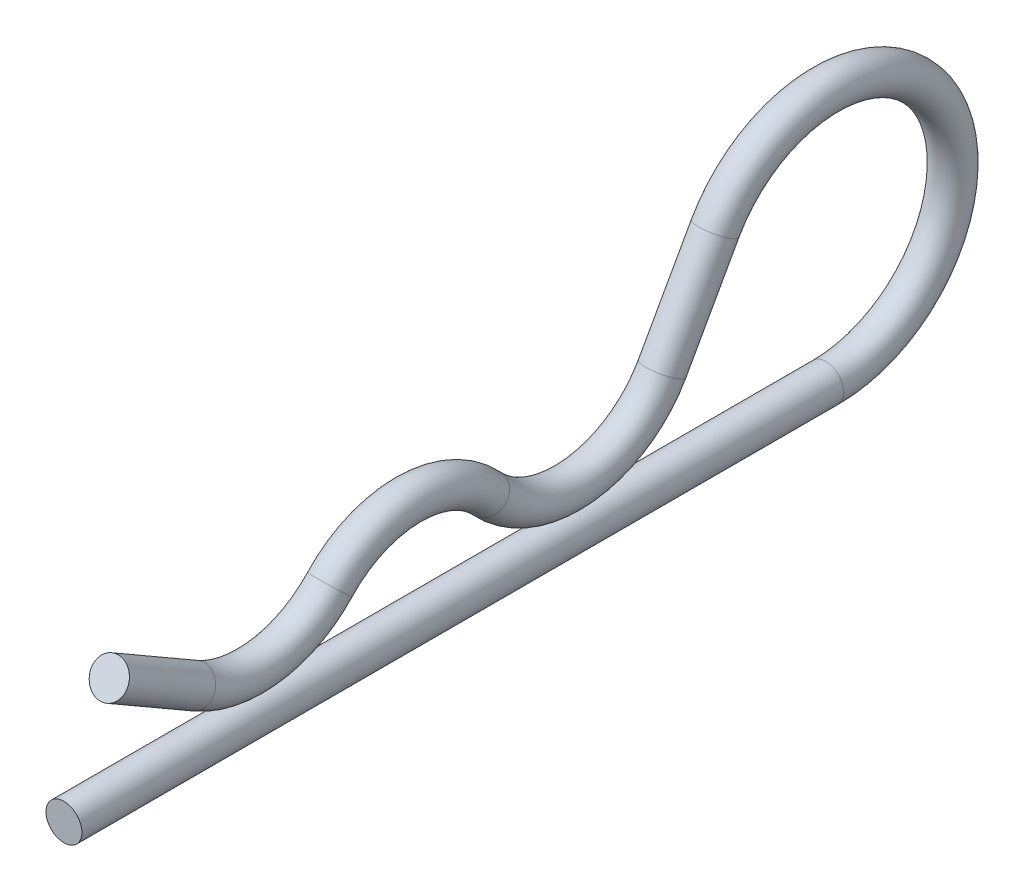
ISO-10303-21;
HEADER;
FILE_DESCRIPTION(('STEP AP214'),'2;1');
FILE_NAME('part.step','',(''),(''),'','','');
FILE_SCHEMA(('AUTOMOTIVE_DESIGN { 1 0 10303 214 1 1 1 1 }'));
ENDSEC;
DATA;
#1=APPLICATION_CONTEXT('core data for automotive mechanical design processes');
#2=APPLICATION_PROTOCOL_DEFINITION('international standard','automotive_design',2000,#1);
#3=PRODUCT_CONTEXT('',#1,'mechanical');
#4=PRODUCT('Part','Part','',(#3));
#5=PRODUCT_RELATED_PRODUCT_CATEGORY('part','',(#4));
#6=PRODUCT_DEFINITION_FORMATION('','',#4);
#7=PRODUCT_DEFINITION_CONTEXT('part definition',#1,'design');
#8=PRODUCT_DEFINITION('design','',#6,#7);
#9=PRODUCT_DEFINITION_SHAPE('','',#8);
#10=(LENGTH_UNIT() NAMED_UNIT(*) SI_UNIT(.MILLI.,.METRE.));
#11=(NAMED_UNIT(*) PLANE_ANGLE_UNIT() SI_UNIT($,.RADIAN.));
#12=(NAMED_UNIT(*) SI_UNIT($,.STERADIAN.) SOLID_ANGLE_UNIT());
#13=UNCERTAINTY_MEASURE_WITH_UNIT(LENGTH_MEASURE(1.E-05),#10,'distance_accuracy_value','');
#14=(GEOMETRIC_REPRESENTATION_CONTEXT(3) GLOBAL_UNCERTAINTY_ASSIGNED_CONTEXT((#13)) GLOBAL_UNIT_ASSIGNED_CONTEXT((#10,
#11,#12)) REPRESENTATION_CONTEXT('',''));
#15=CARTESIAN_POINT('',(0.,0.,0.));
#16=DIRECTION('',(0.,0.,1.));
#17=DIRECTION('',(1.,0.,0.));
#18=AXIS2_PLACEMENT_3D('',#15,#16,#17);
#19=CARTESIAN_POINT('',(0.,0.,16.6751));
#20=DIRECTION('',(0.,0.,1.));
#21=DIRECTION('',(1.,0.,0.));
#22=AXIS2_PLACEMENT_3D('',#19,#20,#21);
#23=PLANE('',#22);
#24=CARTESIAN_POINT('',(0.,0.,16.6751));
#25=DIRECTION('',(0.,0.,1.));
#26=DIRECTION('',(1.,0.,0.));
#27=AXIS2_PLACEMENT_3D('',#24,#25,#26);
#28=CIRCLE('',#27,0.787400000000002);
#29=CARTESIAN_POINT('',(0.787400000000002,0.,16.6751));
#30=VERTEX_POINT('',#29);
#31=EDGE_CURVE('E54',#30,#30,#28,.T.);
#32=ORIENTED_EDGE('',*,*,#31,.T.);
#33=EDGE_LOOP('',(#32));
#34=FACE_BOUND('',#33,.T.);
#35=ADVANCED_FACE('F41',(#34),#23,.T.);
#36=CARTESIAN_POINT('',(0.,4.46971135964693,14.690725));
#37=DIRECTION('',(0.,-0.499999999999994,-0.866025403784442));
#38=DIRECTION('',(1.,0.,0.));
#39=AXIS2_PLACEMENT_3D('',#36,#37,#38);
#40=PLANE('',#39);
#41=CARTESIAN_POINT('',(0.,4.46971135964693,14.690725));
#42=DIRECTION('',(0.,-0.499999999999994,-0.866025403784442));
#43=DIRECTION('',(1.,0.,0.));
#44=AXIS2_PLACEMENT_3D('',#41,#42,#43);
#45=CIRCLE('',#44,0.787400000000002);
#46=CARTESIAN_POINT('',(0.787400000000002,4.46971135964693,14.690725));
#47=VERTEX_POINT('',#46);
#48=EDGE_CURVE('E11',#47,#47,#45,.T.);
#49=ORIENTED_EDGE('',*,*,#48,.F.);
#50=EDGE_LOOP('',(#49));
#51=FACE_BOUND('',#50,.T.);
#52=ADVANCED_FACE('F60',(#51),#40,.F.);
#53=CARTESIAN_POINT('',(0.,0.,16.6751));
#54=DIRECTION('',(0.,0.,-1.));
#55=DIRECTION('',(0.,1.,0.));
#56=AXIS2_PLACEMENT_3D('',#53,#54,#55);
#57=CYLINDRICAL_SURFACE('',#56,0.787400000000002);
#58=CARTESIAN_POINT('',(0.,0.,-16.6751));
#59=DIRECTION('',(0.,0.,1.));
#60=DIRECTION('',(1.,0.,0.));
#61=AXIS2_PLACEMENT_3D('',#58,#59,#60);
#62=CIRCLE('',#61,0.787400000000002);
#63=CARTESIAN_POINT('',(0.,-0.787400000000004,-16.6751));
#64=VERTEX_POINT('',#63);
#65=EDGE_CURVE('E102',#64,#64,#62,.T.);
#66=ORIENTED_EDGE('',*,*,#65,.T.);
#67=EDGE_LOOP('',(#66));
#68=FACE_BOUND('',#67,.T.);
#69=ORIENTED_EDGE('',*,*,#31,.F.);
#70=EDGE_LOOP('',(#69));
#71=FACE_BOUND('',#70,.T.);
#72=ADVANCED_FACE('F62',(#68,#71),#57,.T.);
#73=CARTESIAN_POINT('',(0.,5.5499,-16.6751));
#74=DIRECTION('',(1.,0.,0.));
#75=DIRECTION('',(0.,0.,-1.));
#76=AXIS2_PLACEMENT_3D('',#73,#74,#75);
#77=TOROIDAL_SURFACE('',#76,5.5499,0.787400000000002);
#78=CARTESIAN_POINT('',(0.,8.254232499125,-11.8286605085613));
#79=DIRECTION('',(0.,0.87324807499931,-0.487275896705346));
#80=DIRECTION('',(1.,0.,0.));
#81=AXIS2_PLACEMENT_3D('',#78,#79,#80);
#82=CIRCLE('',#81,0.787400000000002);
#83=CARTESIAN_POINT('',(0.,8.63791354019079,-11.1410649743069));
#84=VERTEX_POINT('',#83);
#85=EDGE_CURVE('E99',#84,#84,#82,.T.);
#86=CARTESIAN_POINT('',(0.,5.5499,-16.6751));
#87=DIRECTION('',(1.,0.,0.));
#88=DIRECTION('',(0.,0.,-1.));
#89=AXIS2_PLACEMENT_3D('',#86,#87,#88);
#90=CIRCLE('',#89,6.3373);
#91=EDGE_CURVE('',#64,#84,#90,.T.);
#92=ORIENTED_EDGE('',*,*,#65,.F.);
#93=ORIENTED_EDGE('',*,*,#85,.T.);
#94=ORIENTED_EDGE('',*,*,#91,.T.);
#95=ORIENTED_EDGE('',*,*,#91,.F.);
#96=EDGE_LOOP('',(#92,#94,#93,#95));
#97=FACE_BOUND('',#96,.T.);
#98=ADVANCED_FACE('F67',(#97),#77,.T.);
#99=CARTESIAN_POINT('',(0.,8.254232499125,-11.8286605085613));
#100=DIRECTION('',(0.,-0.87324807499931,0.487275896705347));
#101=DIRECTION('',(0.,-0.487275896705347,-0.87324807499931));
#102=AXIS2_PLACEMENT_3D('',#99,#100,#101);
#103=CYLINDRICAL_SURFACE('',#102,0.787400000000002);
#104=CARTESIAN_POINT('',(0.,4.09538854194079,-9.50800905050211));
#105=DIRECTION('',(0.,0.873248074999309,-0.487275896705347));
#106=DIRECTION('',(1.,0.,0.));
#107=AXIS2_PLACEMENT_3D('',#104,#105,#106);
#108=CIRCLE('',#107,0.787400000000002);
#109=CARTESIAN_POINT('',(0.,3.711707500875,-10.1956045847566));
#110=VERTEX_POINT('',#109);
#111=EDGE_CURVE('E108',#110,#110,#108,.T.);
#112=ORIENTED_EDGE('',*,*,#111,.T.);
#113=EDGE_LOOP('',(#112));
#114=FACE_BOUND('',#113,.T.);
#115=ORIENTED_EDGE('',*,*,#85,.F.);
#116=EDGE_LOOP('',(#115));
#117=FACE_BOUND('',#116,.T.);
#118=ADVANCED_FACE('F87',(#114,#117),#103,.T.);
#119=CARTESIAN_POINT('',(0.,6.41604,-5.3491650933179));
#120=DIRECTION('',(-1.,0.,0.));
#121=DIRECTION('',(0.,0.,1.));
#122=AXIS2_PLACEMENT_3D('',#119,#120,#121);
#123=TOROIDAL_SURFACE('',#122,4.7625,0.787400000000002);
#124=CARTESIAN_POINT('',(0.,3.18379944473297,-1.85144766006418));
#125=DIRECTION('',(0.,-0.734428857376111,-0.678685680895965));
#126=DIRECTION('',(1.,0.,0.));
#127=AXIS2_PLACEMENT_3D('',#124,#125,#126);
#128=CIRCLE('',#127,0.787400000000002);
#129=CARTESIAN_POINT('',(0.,2.64940233959549,-1.27315837776622));
#130=VERTEX_POINT('',#129);
#131=EDGE_CURVE('E115',#130,#130,#128,.T.);
#132=CARTESIAN_POINT('',(0.,6.41604,-5.3491650933179));
#133=DIRECTION('',(-1.,0.,0.));
#134=DIRECTION('',(0.,0.,1.));
#135=AXIS2_PLACEMENT_3D('',#132,#133,#134);
#136=CIRCLE('',#135,5.5499);
#137=EDGE_CURVE('',#110,#130,#136,.T.);
#138=ORIENTED_EDGE('',*,*,#111,.F.);
#139=ORIENTED_EDGE('',*,*,#131,.T.);
#140=ORIENTED_EDGE('',*,*,#137,.T.);
#141=ORIENTED_EDGE('',*,*,#137,.F.);
#142=EDGE_LOOP('',(#138,#140,#139,#141));
#143=FACE_BOUND('',#142,.T.);
#144=ADVANCED_FACE('F83',(#143),#123,.T.);
#145=CARTESIAN_POINT('',(0.,0.,1.59385));
#146=DIRECTION('',(1.,0.,0.));
#147=DIRECTION('',(0.,0.,-1.));
#148=AXIS2_PLACEMENT_3D('',#145,#146,#147);
#149=TOROIDAL_SURFACE('',#148,4.69112511778631,0.787400000000002);
#150=CARTESIAN_POINT('',(0.,3.18379944473297,5.03914766006418));
#151=DIRECTION('',(0.,0.734428857376111,-0.678685680895965));
#152=DIRECTION('',(1.,0.,0.));
#153=AXIS2_PLACEMENT_3D('',#150,#151,#152);
#154=CIRCLE('',#153,0.787400000000002);
#155=CARTESIAN_POINT('',(0.,2.64940233959549,4.46085837776623));
#156=VERTEX_POINT('',#155);
#157=EDGE_CURVE('E119',#156,#156,#154,.T.);
#158=ORIENTED_EDGE('',*,*,#157,.T.);
#159=EDGE_LOOP('',(#158));
#160=FACE_BOUND('',#159,.T.);
#161=ORIENTED_EDGE('',*,*,#131,.F.);
#162=EDGE_LOOP('',(#161));
#163=FACE_BOUND('',#162,.T.);
#164=ADVANCED_FACE('F77',(#160,#163),#149,.T.);
#165=CARTESIAN_POINT('',(0.,6.41604,8.53686509331791));
#166=DIRECTION('',(-1.,0.,0.));
#167=DIRECTION('',(0.,0.,1.));
#168=AXIS2_PLACEMENT_3D('',#165,#166,#167);
#169=TOROIDAL_SURFACE('',#168,4.7625,0.787400000000002);
#170=CARTESIAN_POINT('',(0.,2.2915940144766,10.9181150933179));
#171=DIRECTION('',(0.,-0.499999999999994,-0.866025403784442));
#172=DIRECTION('',(1.,0.,0.));
#173=AXIS2_PLACEMENT_3D('',#170,#171,#172);
#174=CIRCLE('',#173,0.787400000000002);
#175=CARTESIAN_POINT('',(0.,1.60968561153673,11.3118150933179));
#176=VERTEX_POINT('',#175);
#177=EDGE_CURVE('E49',#176,#176,#174,.T.);
#178=CARTESIAN_POINT('',(0.,6.41604,8.53686509331791));
#179=DIRECTION('',(-1.,0.,0.));
#180=DIRECTION('',(0.,0.,1.));
#181=AXIS2_PLACEMENT_3D('',#178,#179,#180);
#182=CIRCLE('',#181,5.5499);
#183=EDGE_CURVE('',#156,#176,#182,.T.);
#184=ORIENTED_EDGE('',*,*,#157,.F.);
#185=ORIENTED_EDGE('',*,*,#177,.T.);
#186=ORIENTED_EDGE('',*,*,#183,.T.);
#187=ORIENTED_EDGE('',*,*,#183,.F.);
#188=EDGE_LOOP('',(#184,#186,#185,#187));
#189=FACE_BOUND('',#188,.T.);
#190=ADVANCED_FACE('F73',(#189),#169,.T.);
#191=CARTESIAN_POINT('',(0.,2.2915940144766,10.9181150933179));
#192=DIRECTION('',(0.,0.499999999999994,0.866025403784442));
#193=DIRECTION('',(0.,-0.866025403784442,0.499999999999994));
#194=AXIS2_PLACEMENT_3D('',#191,#192,#193);
#195=CYLINDRICAL_SURFACE('',#194,0.787400000000002);
#196=ORIENTED_EDGE('',*,*,#48,.T.);
#197=EDGE_LOOP('',(#196));
#198=FACE_BOUND('',#197,.T.);
#199=ORIENTED_EDGE('',*,*,#177,.F.);
#200=EDGE_LOOP('',(#199));
#201=FACE_BOUND('',#200,.T.);
#202=ADVANCED_FACE('F57',(#198,#201),#195,.T.);
#203=CLOSED_SHELL('',(#35,#52,#72,#98,#118,#144,#164,#190,#202));
#204=MANIFOLD_SOLID_BREP('B2',#203);
#205=ADVANCED_BREP_SHAPE_REPRESENTATION('',(#18,#204),#14);
#206=SHAPE_DEFINITION_REPRESENTATION(#9,#205);
ENDSEC;
END-ISO-10303-21;
